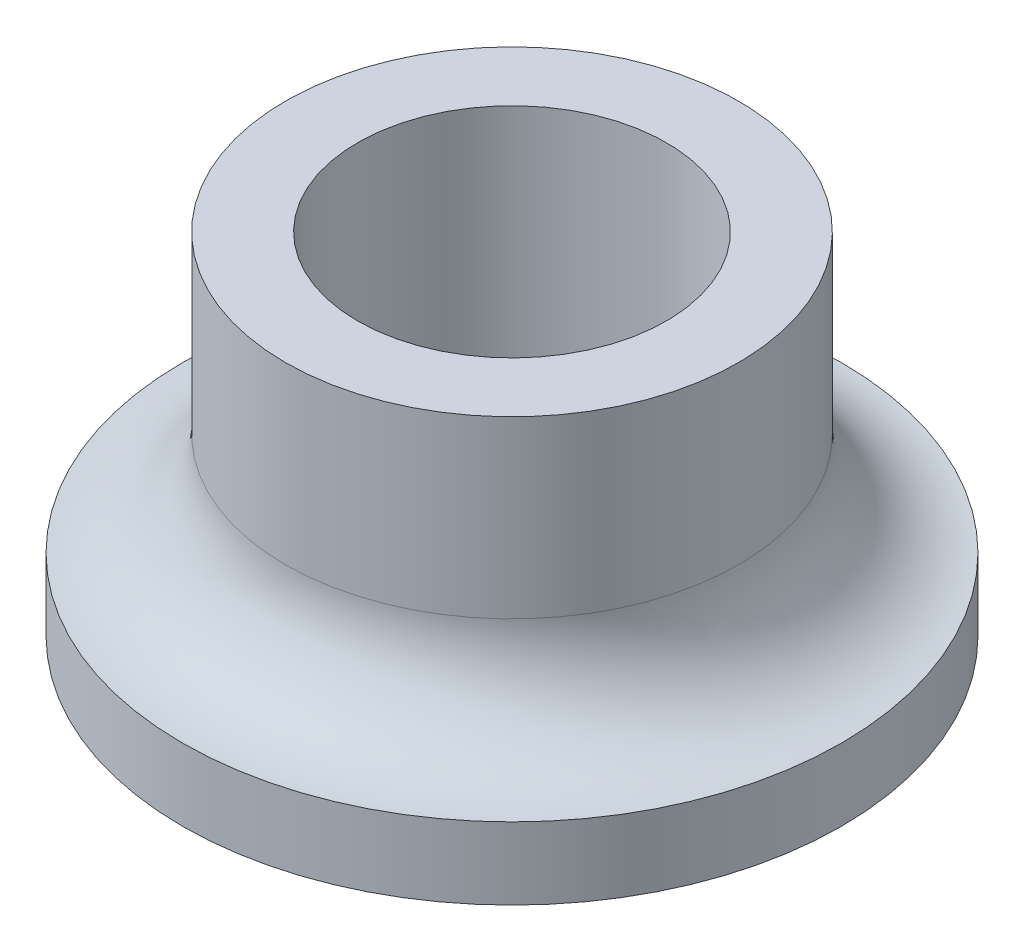
ISO-10303-21;
HEADER;
FILE_DESCRIPTION(('STEP AP214'),'2;1');
FILE_NAME('part.step','',(''),(''),'','','');
FILE_SCHEMA(('AUTOMOTIVE_DESIGN { 1 0 10303 214 1 1 1 1 }'));
ENDSEC;
DATA;
#1=APPLICATION_CONTEXT('core data for automotive mechanical design processes');
#2=APPLICATION_PROTOCOL_DEFINITION('international standard','automotive_design',2000,#1);
#3=PRODUCT_CONTEXT('',#1,'mechanical');
#4=PRODUCT('Part','Part','',(#3));
#5=PRODUCT_RELATED_PRODUCT_CATEGORY('part','',(#4));
#6=PRODUCT_DEFINITION_FORMATION('','',#4);
#7=PRODUCT_DEFINITION_CONTEXT('part definition',#1,'design');
#8=PRODUCT_DEFINITION('design','',#6,#7);
#9=PRODUCT_DEFINITION_SHAPE('','',#8);
#10=(LENGTH_UNIT() NAMED_UNIT(*) SI_UNIT(.MILLI.,.METRE.));
#11=(NAMED_UNIT(*) PLANE_ANGLE_UNIT() SI_UNIT($,.RADIAN.));
#12=(NAMED_UNIT(*) SI_UNIT($,.STERADIAN.) SOLID_ANGLE_UNIT());
#13=UNCERTAINTY_MEASURE_WITH_UNIT(LENGTH_MEASURE(1.E-05),#10,'distance_accuracy_value','');
#14=(GEOMETRIC_REPRESENTATION_CONTEXT(3) GLOBAL_UNCERTAINTY_ASSIGNED_CONTEXT((#13)) GLOBAL_UNIT_ASSIGNED_CONTEXT((#10,
#11,#12)) REPRESENTATION_CONTEXT('',''));
#15=CARTESIAN_POINT('',(0.,0.,0.));
#16=DIRECTION('',(0.,0.,1.));
#17=DIRECTION('',(1.,0.,0.));
#18=AXIS2_PLACEMENT_3D('',#15,#16,#17);
#19=CARTESIAN_POINT('',(0.,0.,0.));
#20=DIRECTION('',(0.,1.,0.));
#21=DIRECTION('',(0.,0.,1.));
#22=AXIS2_PLACEMENT_3D('',#19,#20,#21);
#23=PLANE('',#22);
#24=CARTESIAN_POINT('',(0.,0.,0.));
#25=DIRECTION('',(0.,1.,0.));
#26=DIRECTION('',(0.,0.,1.));
#27=AXIS2_PLACEMENT_3D('',#24,#25,#26);
#28=CIRCLE('',#27,16.);
#29=CARTESIAN_POINT('',(0.,0.,16.));
#30=VERTEX_POINT('',#29);
#31=EDGE_CURVE('E50',#30,#30,#28,.T.);
#32=ORIENTED_EDGE('',*,*,#31,.F.);
#33=EDGE_LOOP('',(#32));
#34=FACE_BOUND('',#33,.T.);
#35=CARTESIAN_POINT('',(0.,0.,0.));
#36=DIRECTION('',(0.,1.,0.));
#37=DIRECTION('',(0.,0.,1.));
#38=AXIS2_PLACEMENT_3D('',#35,#36,#37);
#39=CIRCLE('',#38,7.5);
#40=CARTESIAN_POINT('',(0.,0.,7.5));
#41=VERTEX_POINT('',#40);
#42=EDGE_CURVE('E56',#41,#41,#39,.T.);
#43=ORIENTED_EDGE('',*,*,#42,.T.);
#44=EDGE_LOOP('',(#43));
#45=FACE_BOUND('',#44,.T.);
#46=ADVANCED_FACE('F37',(#34,#45),#23,.F.);
#47=CARTESIAN_POINT('',(0.,3.5,0.));
#48=DIRECTION('',(0.,-1.,0.));
#49=DIRECTION('',(0.,0.,-1.));
#50=AXIS2_PLACEMENT_3D('',#47,#48,#49);
#51=CYLINDRICAL_SURFACE('',#50,16.);
#52=CARTESIAN_POINT('',(0.,3.5,0.));
#53=DIRECTION('',(0.,1.,0.));
#54=DIRECTION('',(0.,0.,1.));
#55=AXIS2_PLACEMENT_3D('',#52,#53,#54);
#56=CIRCLE('',#55,16.);
#57=CARTESIAN_POINT('',(0.,3.5,16.));
#58=VERTEX_POINT('',#57);
#59=EDGE_CURVE('E45',#58,#58,#56,.T.);
#60=ORIENTED_EDGE('',*,*,#59,.F.);
#61=EDGE_LOOP('',(#60));
#62=FACE_BOUND('',#61,.T.);
#63=ORIENTED_EDGE('',*,*,#31,.T.);
#64=EDGE_LOOP('',(#63));
#65=FACE_BOUND('',#64,.T.);
#66=ADVANCED_FACE('F82',(#62,#65),#51,.T.);
#67=CARTESIAN_POINT('',(0.,3.5,0.));
#68=DIRECTION('',(0.,-1.,0.));
#69=DIRECTION('',(0.,0.,-1.));
#70=AXIS2_PLACEMENT_3D('',#67,#68,#69);
#71=CYLINDRICAL_SURFACE('',#70,7.5);
#72=ORIENTED_EDGE('',*,*,#42,.F.);
#73=EDGE_LOOP('',(#72));
#74=FACE_BOUND('',#73,.T.);
#75=CARTESIAN_POINT('',(0.,17.,0.));
#76=DIRECTION('',(0.,1.,0.));
#77=DIRECTION('',(0.,0.,1.));
#78=AXIS2_PLACEMENT_3D('',#75,#76,#77);
#79=CIRCLE('',#78,7.5);
#80=CARTESIAN_POINT('',(0.,17.,7.5));
#81=VERTEX_POINT('',#80);
#82=EDGE_CURVE('E65',#81,#81,#79,.T.);
#83=ORIENTED_EDGE('',*,*,#82,.T.);
#84=EDGE_LOOP('',(#83));
#85=FACE_BOUND('',#84,.T.);
#86=ADVANCED_FACE('F70',(#74,#85),#71,.F.);
#87=CARTESIAN_POINT('',(0.,17.,0.));
#88=DIRECTION('',(0.,1.,0.));
#89=DIRECTION('',(0.,0.,1.));
#90=AXIS2_PLACEMENT_3D('',#87,#88,#89);
#91=PLANE('',#90);
#92=CARTESIAN_POINT('',(0.,17.,0.));
#93=DIRECTION('',(0.,1.,0.));
#94=DIRECTION('',(0.,0.,1.));
#95=AXIS2_PLACEMENT_3D('',#92,#93,#94);
#96=CIRCLE('',#95,11.);
#97=CARTESIAN_POINT('',(0.,17.,11.));
#98=VERTEX_POINT('',#97);
#99=EDGE_CURVE('E61',#98,#98,#96,.T.);
#100=ORIENTED_EDGE('',*,*,#99,.T.);
#101=EDGE_LOOP('',(#100));
#102=FACE_BOUND('',#101,.T.);
#103=ORIENTED_EDGE('',*,*,#82,.F.);
#104=EDGE_LOOP('',(#103));
#105=FACE_BOUND('',#104,.T.);
#106=ADVANCED_FACE('F72',(#102,#105),#91,.T.);
#107=CARTESIAN_POINT('',(0.,17.,0.));
#108=DIRECTION('',(0.,-1.,0.));
#109=DIRECTION('',(0.,0.,-1.));
#110=AXIS2_PLACEMENT_3D('',#107,#108,#109);
#111=CYLINDRICAL_SURFACE('',#110,11.);
#112=CARTESIAN_POINT('',(0.,8.5,0.));
#113=DIRECTION('',(0.,1.,0.));
#114=DIRECTION('',(0.,0.,1.));
#115=AXIS2_PLACEMENT_3D('',#112,#113,#114);
#116=CIRCLE('',#115,11.);
#117=CARTESIAN_POINT('',(0.,8.5,11.));
#118=VERTEX_POINT('',#117);
#119=EDGE_CURVE('E10',#118,#118,#116,.T.);
#120=ORIENTED_EDGE('',*,*,#119,.T.);
#121=EDGE_LOOP('',(#120));
#122=FACE_BOUND('',#121,.T.);
#123=ORIENTED_EDGE('',*,*,#99,.F.);
#124=EDGE_LOOP('',(#123));
#125=FACE_BOUND('',#124,.T.);
#126=ADVANCED_FACE('F74',(#122,#125),#111,.T.);
#127=CARTESIAN_POINT('',(0.,8.5,0.));
#128=DIRECTION('',(0.,1.,0.));
#129=DIRECTION('',(0.,0.,1.));
#130=AXIS2_PLACEMENT_3D('',#127,#128,#129);
#131=TOROIDAL_SURFACE('',#130,16.,5.);
#132=ORIENTED_EDGE('',*,*,#59,.T.);
#133=EDGE_LOOP('',(#132));
#134=FACE_BOUND('',#133,.T.);
#135=ORIENTED_EDGE('',*,*,#119,.F.);
#136=EDGE_LOOP('',(#135));
#137=FACE_BOUND('',#136,.T.);
#138=ADVANCED_FACE('F39',(#134,#137),#131,.F.);
#139=CLOSED_SHELL('',(#46,#66,#86,#106,#126,#138));
#140=MANIFOLD_SOLID_BREP('B2',#139);
#141=ADVANCED_BREP_SHAPE_REPRESENTATION('',(#18,#140),#14);
#142=SHAPE_DEFINITION_REPRESENTATION(#9,#141);
ENDSEC;
END-ISO-10303-21;
